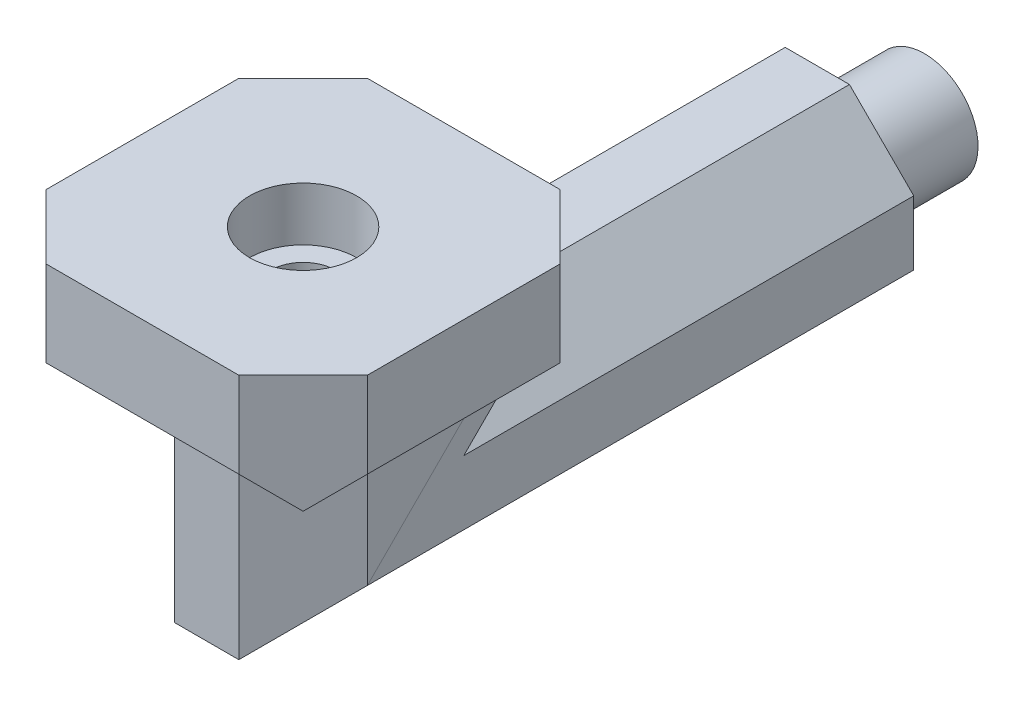
ISO-10303-21;
HEADER;
FILE_DESCRIPTION(('STEP AP214'),'2;1');
FILE_NAME('part.step','',(''),(''),'','','');
FILE_SCHEMA(('AUTOMOTIVE_DESIGN { 1 0 10303 214 1 1 1 1 }'));
ENDSEC;
DATA;
#1=APPLICATION_CONTEXT('core data for automotive mechanical design processes');
#2=APPLICATION_PROTOCOL_DEFINITION('international standard','automotive_design',2000,#1);
#3=PRODUCT_CONTEXT('',#1,'mechanical');
#4=PRODUCT('Part','Part','',(#3));
#5=PRODUCT_RELATED_PRODUCT_CATEGORY('part','',(#4));
#6=PRODUCT_DEFINITION_FORMATION('','',#4);
#7=PRODUCT_DEFINITION_CONTEXT('part definition',#1,'design');
#8=PRODUCT_DEFINITION('design','',#6,#7);
#9=PRODUCT_DEFINITION_SHAPE('','',#8);
#10=(LENGTH_UNIT() NAMED_UNIT(*) SI_UNIT(.MILLI.,.METRE.));
#11=(NAMED_UNIT(*) PLANE_ANGLE_UNIT() SI_UNIT($,.RADIAN.));
#12=(NAMED_UNIT(*) SI_UNIT($,.STERADIAN.) SOLID_ANGLE_UNIT());
#13=UNCERTAINTY_MEASURE_WITH_UNIT(LENGTH_MEASURE(1.E-05),#10,'distance_accuracy_value','');
#14=(GEOMETRIC_REPRESENTATION_CONTEXT(3) GLOBAL_UNCERTAINTY_ASSIGNED_CONTEXT((#13)) GLOBAL_UNIT_ASSIGNED_CONTEXT((#10,
#11,#12)) REPRESENTATION_CONTEXT('',''));
#15=CARTESIAN_POINT('',(0.,0.,0.));
#16=DIRECTION('',(0.,0.,1.));
#17=DIRECTION('',(1.,0.,0.));
#18=AXIS2_PLACEMENT_3D('',#15,#16,#17);
#19=CARTESIAN_POINT('',(-4.5,-11.5,5.05));
#20=DIRECTION('',(0.,-1.,0.));
#21=DIRECTION('',(0.,0.,-1.));
#22=AXIS2_PLACEMENT_3D('',#19,#20,#21);
#23=PLANE('',#22);
#24=CARTESIAN_POINT('',(0.,-11.5,0.));
#25=DIRECTION('',(0.,1.,0.));
#26=DIRECTION('',(0.,0.,1.));
#27=AXIS2_PLACEMENT_3D('',#24,#25,#26);
#28=CIRCLE('',#27,1.5);
#29=CARTESIAN_POINT('',(-1.49999999999999,-11.5,0.));
#30=VERTEX_POINT('',#29);
#31=CARTESIAN_POINT('',(1.49999999999999,-11.5,0.));
#32=VERTEX_POINT('',#31);
#33=EDGE_CURVE('E113',#30,#32,#28,.T.);
#34=ORIENTED_EDGE('',*,*,#33,.T.);
#35=DIRECTION('',(0.,0.,1.));
#36=VECTOR('',#35,1.);
#37=CARTESIAN_POINT('',(1.49999999999998,-11.5,5.05));
#38=LINE('',#37,#36);
#39=CARTESIAN_POINT('',(1.49999999999998,-11.5,4.5));
#40=VERTEX_POINT('',#39);
#41=EDGE_CURVE('E267',#32,#40,#38,.T.);
#42=ORIENTED_EDGE('',*,*,#41,.T.);
#43=DIRECTION('',(1.,0.,0.));
#44=VECTOR('',#43,1.);
#45=CARTESIAN_POINT('',(-4.5,-11.5,4.5));
#46=LINE('',#45,#44);
#47=CARTESIAN_POINT('',(-1.5,-11.5,4.5));
#48=VERTEX_POINT('',#47);
#49=EDGE_CURVE('E330',#48,#40,#46,.T.);
#50=ORIENTED_EDGE('',*,*,#49,.F.);
#51=DIRECTION('',(0.,0.,-1.));
#52=VECTOR('',#51,1.);
#53=CARTESIAN_POINT('',(-1.5,-11.5,5.05));
#54=LINE('',#53,#52);
#55=EDGE_CURVE('E270',#48,#30,#54,.T.);
#56=ORIENTED_EDGE('',*,*,#55,.T.);
#57=EDGE_LOOP('',(#34,#42,#50,#56));
#58=FACE_BOUND('',#57,.T.);
#59=ADVANCED_FACE('F98',(#58),#23,.T.);
#60=CARTESIAN_POINT('',(-4.5,-11.5,5.05));
#61=DIRECTION('',(-1.,0.,0.));
#62=DIRECTION('',(0.,-1.,0.));
#63=AXIS2_PLACEMENT_3D('',#60,#61,#62);
#64=PLANE('',#63);
#65=DIRECTION('',(0.,0.,-1.));
#66=VECTOR('',#65,1.);
#67=CARTESIAN_POINT('',(-4.5,-5.5,5.05));
#68=LINE('',#67,#66);
#69=CARTESIAN_POINT('',(-4.5,-5.5,-3.00000000000009));
#70=VERTEX_POINT('',#69);
#71=CARTESIAN_POINT('',(-4.5,-5.5,-24.));
#72=VERTEX_POINT('',#71);
#73=EDGE_CURVE('E279',#70,#72,#68,.T.);
#74=ORIENTED_EDGE('',*,*,#73,.T.);
#75=DIRECTION('',(0.,-1.,0.));
#76=VECTOR('',#75,1.);
#77=CARTESIAN_POINT('',(-4.5,-11.5,-24.));
#78=LINE('',#77,#76);
#79=CARTESIAN_POINT('',(-4.5,-8.49999999999999,-24.));
#80=VERTEX_POINT('',#79);
#81=EDGE_CURVE('E316',#72,#80,#78,.T.);
#82=ORIENTED_EDGE('',*,*,#81,.T.);
#83=DIRECTION('',(0.,0.,1.));
#84=VECTOR('',#83,1.);
#85=CARTESIAN_POINT('',(-4.5,-8.49999999999999,5.05));
#86=LINE('',#85,#84);
#87=CARTESIAN_POINT('',(-4.5,-8.49999999999999,1.49999999999999));
#88=VERTEX_POINT('',#87);
#89=EDGE_CURVE('E447',#80,#88,#86,.T.);
#90=ORIENTED_EDGE('',*,*,#89,.T.);
#91=DIRECTION('',(0.,-0.707106781186548,0.707106781186548));
#92=VECTOR('',#91,1.);
#93=CARTESIAN_POINT('',(-4.5,-5.75,-1.25));
#94=LINE('',#93,#92);
#95=CARTESIAN_POINT('',(-4.5,-4.00000000000007,-2.99999999999993));
#96=VERTEX_POINT('',#95);
#97=EDGE_CURVE('E332',#96,#88,#94,.T.);
#98=ORIENTED_EDGE('',*,*,#97,.F.);
#99=DIRECTION('',(0.,0.,-1.));
#100=VECTOR('',#99,1.);
#101=CARTESIAN_POINT('',(-4.5,-4.00000000000007,5.05));
#102=LINE('',#101,#100);
#103=CARTESIAN_POINT('',(-4.5,-4.00000000000007,-4.5));
#104=VERTEX_POINT('',#103);
#105=EDGE_CURVE('E383',#96,#104,#102,.T.);
#106=ORIENTED_EDGE('',*,*,#105,.T.);
#107=DIRECTION('',(0.,-0.707106781186551,0.707106781186544));
#108=VECTOR('',#107,1.);
#109=CARTESIAN_POINT('',(-4.5,-4.00000000000007,-4.5));
#110=LINE('',#109,#108);
#111=EDGE_CURVE('E448',#104,#70,#110,.T.);
#112=ORIENTED_EDGE('',*,*,#111,.T.);
#113=EDGE_LOOP('',(#74,#82,#90,#98,#106,#112));
#114=FACE_BOUND('',#113,.T.);
#115=ADVANCED_FACE('F451',(#114),#64,.T.);
#116=CARTESIAN_POINT('',(-4.5,-2.5,5.05));
#117=DIRECTION('',(0.,1.,0.));
#118=DIRECTION('',(0.,0.,1.));
#119=AXIS2_PLACEMENT_3D('',#116,#117,#118);
#120=PLANE('',#119);
#121=DIRECTION('',(0.,0.,-1.));
#122=VECTOR('',#121,1.);
#123=CARTESIAN_POINT('',(1.5,-2.5,5.05));
#124=LINE('',#123,#122);
#125=CARTESIAN_POINT('',(1.5,-2.5,-6.00000000000006));
#126=VERTEX_POINT('',#125);
#127=CARTESIAN_POINT('',(1.5,-2.5,-24.));
#128=VERTEX_POINT('',#127);
#129=EDGE_CURVE('E437',#126,#128,#124,.T.);
#130=ORIENTED_EDGE('',*,*,#129,.T.);
#131=DIRECTION('',(-1.,0.,0.));
#132=VECTOR('',#131,1.);
#133=CARTESIAN_POINT('',(-4.5,-2.5,-24.));
#134=LINE('',#133,#132);
#135=CARTESIAN_POINT('',(-1.49999999999998,-2.5,-24.));
#136=VERTEX_POINT('',#135);
#137=EDGE_CURVE('E323',#128,#136,#134,.T.);
#138=ORIENTED_EDGE('',*,*,#137,.T.);
#139=DIRECTION('',(0.,0.,1.));
#140=VECTOR('',#139,1.);
#141=CARTESIAN_POINT('',(-1.49999999999998,-2.5,5.05));
#142=LINE('',#141,#140);
#143=CARTESIAN_POINT('',(-1.49999999999998,-2.5,-6.00000000000006));
#144=VERTEX_POINT('',#143);
#145=EDGE_CURVE('E426',#136,#144,#142,.T.);
#146=ORIENTED_EDGE('',*,*,#145,.T.);
#147=DIRECTION('',(1.,0.,0.));
#148=VECTOR('',#147,1.);
#149=CARTESIAN_POINT('',(-4.5,-2.5,-6.00000000000006));
#150=LINE('',#149,#148);
#151=EDGE_CURVE('E377',#144,#126,#150,.T.);
#152=ORIENTED_EDGE('',*,*,#151,.T.);
#153=EDGE_LOOP('',(#130,#138,#146,#152));
#154=FACE_BOUND('',#153,.T.);
#155=ADVANCED_FACE('F463',(#154),#120,.T.);
#156=CARTESIAN_POINT('',(4.5,-11.5,5.05));
#157=DIRECTION('',(1.,0.,0.));
#158=DIRECTION('',(0.,1.,0.));
#159=AXIS2_PLACEMENT_3D('',#156,#157,#158);
#160=PLANE('',#159);
#161=DIRECTION('',(0.,0.,-1.));
#162=VECTOR('',#161,1.);
#163=CARTESIAN_POINT('',(4.5,-8.49999999999999,5.05));
#164=LINE('',#163,#162);
#165=CARTESIAN_POINT('',(4.5,-8.49999999999999,1.49999999999999));
#166=VERTEX_POINT('',#165);
#167=CARTESIAN_POINT('',(4.5,-8.49999999999999,-24.));
#168=VERTEX_POINT('',#167);
#169=EDGE_CURVE('E440',#166,#168,#164,.T.);
#170=ORIENTED_EDGE('',*,*,#169,.T.);
#171=DIRECTION('',(0.,1.,0.));
#172=VECTOR('',#171,1.);
#173=CARTESIAN_POINT('',(4.5,-11.5,-24.));
#174=LINE('',#173,#172);
#175=CARTESIAN_POINT('',(4.5,-5.50000000000001,-24.));
#176=VERTEX_POINT('',#175);
#177=EDGE_CURVE('E121',#168,#176,#174,.T.);
#178=ORIENTED_EDGE('',*,*,#177,.T.);
#179=DIRECTION('',(0.,0.,1.));
#180=VECTOR('',#179,1.);
#181=CARTESIAN_POINT('',(4.5,-5.50000000000001,5.05));
#182=LINE('',#181,#180);
#183=CARTESIAN_POINT('',(4.5,-5.50000000000001,-3.00000000000008));
#184=VERTEX_POINT('',#183);
#185=EDGE_CURVE('E445',#176,#184,#182,.T.);
#186=ORIENTED_EDGE('',*,*,#185,.T.);
#187=DIRECTION('',(0.,0.707106781186551,-0.707106781186544));
#188=VECTOR('',#187,1.);
#189=CARTESIAN_POINT('',(4.5,-4.00000000000007,-4.5));
#190=LINE('',#189,#188);
#191=CARTESIAN_POINT('',(4.5,-4.00000000000007,-4.5));
#192=VERTEX_POINT('',#191);
#193=EDGE_CURVE('E443',#184,#192,#190,.T.);
#194=ORIENTED_EDGE('',*,*,#193,.T.);
#195=DIRECTION('',(0.,0.,1.));
#196=VECTOR('',#195,1.);
#197=CARTESIAN_POINT('',(4.5,-4.00000000000007,5.05));
#198=LINE('',#197,#196);
#199=CARTESIAN_POINT('',(4.5,-4.00000000000007,-2.99999999999993));
#200=VERTEX_POINT('',#199);
#201=EDGE_CURVE('E380',#192,#200,#198,.T.);
#202=ORIENTED_EDGE('',*,*,#201,.T.);
#203=DIRECTION('',(0.,0.707106781186548,-0.707106781186548));
#204=VECTOR('',#203,1.);
#205=CARTESIAN_POINT('',(4.5,-5.75,-1.25));
#206=LINE('',#205,#204);
#207=EDGE_CURVE('E327',#166,#200,#206,.T.);
#208=ORIENTED_EDGE('',*,*,#207,.F.);
#209=EDGE_LOOP('',(#170,#178,#186,#194,#202,#208));
#210=FACE_BOUND('',#209,.T.);
#211=ADVANCED_FACE('F554',(#210),#160,.T.);
#212=EDGE_CURVE('E256',#32,#30,#28,.T.);
#213=ORIENTED_EDGE('',*,*,#212,.T.);
#214=CARTESIAN_POINT('',(-1.5,-11.5,-24.));
#215=VERTEX_POINT('',#214);
#216=EDGE_CURVE('E285',#30,#215,#54,.T.);
#217=ORIENTED_EDGE('',*,*,#216,.T.);
#218=DIRECTION('',(1.,0.,0.));
#219=VECTOR('',#218,1.);
#220=CARTESIAN_POINT('',(-4.5,-11.5,-24.));
#221=LINE('',#220,#219);
#222=CARTESIAN_POINT('',(1.49999999999998,-11.5,-24.));
#223=VERTEX_POINT('',#222);
#224=EDGE_CURVE('E284',#215,#223,#221,.T.);
#225=ORIENTED_EDGE('',*,*,#224,.T.);
#226=EDGE_CURVE('E275',#223,#32,#38,.T.);
#227=ORIENTED_EDGE('',*,*,#226,.T.);
#228=EDGE_LOOP('',(#213,#217,#225,#227));
#229=FACE_BOUND('',#228,.T.);
#230=ADVANCED_FACE('F282',(#229),#23,.T.);
#231=CARTESIAN_POINT('',(1.5,-2.5,5.05));
#232=DIRECTION('',(-0.707106781186549,-0.707106781186546,0.));
#233=DIRECTION('',(0.,0.,-1.));
#234=AXIS2_PLACEMENT_3D('',#231,#232,#233);
#235=PLANE('',#234);
#236=ORIENTED_EDGE('',*,*,#185,.F.);
#237=DIRECTION('',(0.707106781186546,-0.707106781186549,0.));
#238=VECTOR('',#237,1.);
#239=CARTESIAN_POINT('',(1.5,-2.5,-24.));
#240=LINE('',#239,#238);
#241=EDGE_CURVE('E469',#176,#128,#240,.F.);
#242=ORIENTED_EDGE('',*,*,#241,.T.);
#243=ORIENTED_EDGE('',*,*,#129,.F.);
#244=DIRECTION('',(0.577350269189627,-0.577350269189629,0.577350269189622));
#245=VECTOR('',#244,1.);
#246=CARTESIAN_POINT('',(0.500000000000039,-1.50000000000003,-7.00000000000001));
#247=LINE('',#246,#245);
#248=EDGE_CURVE('E298',#184,#126,#247,.F.);
#249=ORIENTED_EDGE('',*,*,#248,.F.);
#250=EDGE_LOOP('',(#236,#242,#243,#249));
#251=FACE_BOUND('',#250,.T.);
#252=ADVANCED_FACE('F468',(#251),#235,.F.);
#253=CARTESIAN_POINT('',(-4.5,-5.5,5.05));
#254=DIRECTION('',(0.707106781186546,-0.707106781186549,0.));
#255=DIRECTION('',(0.,0.,-1.));
#256=AXIS2_PLACEMENT_3D('',#253,#254,#255);
#257=PLANE('',#256);
#258=ORIENTED_EDGE('',*,*,#145,.F.);
#259=DIRECTION('',(0.707106781186549,0.707106781186546,0.));
#260=VECTOR('',#259,1.);
#261=CARTESIAN_POINT('',(-4.5,-5.5,-24.));
#262=LINE('',#261,#260);
#263=EDGE_CURVE('E314',#136,#72,#262,.F.);
#264=ORIENTED_EDGE('',*,*,#263,.T.);
#265=ORIENTED_EDGE('',*,*,#73,.F.);
#266=DIRECTION('',(0.57735026918963,0.577350269189627,-0.577350269189621));
#267=VECTOR('',#266,1.);
#268=CARTESIAN_POINT('',(-3.50000000000005,-4.50000000000005,-4.00000000000002));
#269=LINE('',#268,#267);
#270=EDGE_CURVE('E300',#144,#70,#269,.F.);
#271=ORIENTED_EDGE('',*,*,#270,.F.);
#272=EDGE_LOOP('',(#258,#264,#265,#271));
#273=FACE_BOUND('',#272,.T.);
#274=ADVANCED_FACE('F454',(#273),#257,.F.);
#275=CARTESIAN_POINT('',(-1.5,-11.5,5.05));
#276=DIRECTION('',(0.707106781186549,0.707106781186546,0.));
#277=DIRECTION('',(0.,0.,-1.));
#278=AXIS2_PLACEMENT_3D('',#275,#276,#277);
#279=PLANE('',#278);
#280=ORIENTED_EDGE('',*,*,#89,.F.);
#281=DIRECTION('',(-0.707106781186546,0.707106781186549,0.));
#282=VECTOR('',#281,1.);
#283=CARTESIAN_POINT('',(-1.5,-11.5,-24.));
#284=LINE('',#283,#282);
#285=EDGE_CURVE('E470',#80,#215,#284,.F.);
#286=ORIENTED_EDGE('',*,*,#285,.T.);
#287=ORIENTED_EDGE('',*,*,#216,.F.);
#288=ORIENTED_EDGE('',*,*,#55,.F.);
#289=DIRECTION('',(0.577350269189625,-0.577350269189627,0.577350269189626));
#290=VECTOR('',#289,1.);
#291=CARTESIAN_POINT('',(-5.33333333333333,-7.66666666666666,0.666666666666656));
#292=LINE('',#291,#290);
#293=EDGE_CURVE('E311',#48,#88,#292,.F.);
#294=ORIENTED_EDGE('',*,*,#293,.T.);
#295=EDGE_LOOP('',(#280,#286,#287,#288,#294));
#296=FACE_BOUND('',#295,.T.);
#297=ADVANCED_FACE('F559',(#296),#279,.F.);
#298=CARTESIAN_POINT('',(4.5,-8.49999999999999,5.05));
#299=DIRECTION('',(-0.707106781186546,0.707106781186549,0.));
#300=DIRECTION('',(0.,0.,-1.));
#301=AXIS2_PLACEMENT_3D('',#298,#299,#300);
#302=PLANE('',#301);
#303=ORIENTED_EDGE('',*,*,#226,.F.);
#304=DIRECTION('',(-0.707106781186549,-0.707106781186546,0.));
#305=VECTOR('',#304,1.);
#306=CARTESIAN_POINT('',(4.5,-8.49999999999999,-24.));
#307=LINE('',#306,#305);
#308=EDGE_CURVE('E13',#223,#168,#307,.F.);
#309=ORIENTED_EDGE('',*,*,#308,.T.);
#310=ORIENTED_EDGE('',*,*,#169,.F.);
#311=DIRECTION('',(0.577350269189627,0.577350269189625,-0.577350269189625));
#312=VECTOR('',#311,1.);
#313=CARTESIAN_POINT('',(7.33333333333333,-5.66666666666667,-1.33333333333333));
#314=LINE('',#313,#312);
#315=EDGE_CURVE('E278',#166,#40,#314,.F.);
#316=ORIENTED_EDGE('',*,*,#315,.T.);
#317=ORIENTED_EDGE('',*,*,#41,.F.);
#318=EDGE_LOOP('',(#303,#309,#310,#316,#317));
#319=FACE_BOUND('',#318,.T.);
#320=ADVANCED_FACE('F274',(#319),#302,.F.);
#321=CARTESIAN_POINT('',(0.,3.,0.));
#322=DIRECTION('',(0.,-1.,0.));
#323=DIRECTION('',(0.,0.,-1.));
#324=AXIS2_PLACEMENT_3D('',#321,#322,#323);
#325=CYLINDRICAL_SURFACE('',#324,2.5);
#326=CARTESIAN_POINT('',(0.,0.5,0.));
#327=DIRECTION('',(0.,1.,0.));
#328=DIRECTION('',(0.,0.,1.));
#329=AXIS2_PLACEMENT_3D('',#326,#327,#328);
#330=CIRCLE('',#329,2.5);
#331=CARTESIAN_POINT('',(0.,0.5,2.5));
#332=VERTEX_POINT('',#331);
#333=EDGE_CURVE('E374',#332,#332,#330,.T.);
#334=ORIENTED_EDGE('',*,*,#333,.F.);
#335=EDGE_LOOP('',(#334));
#336=FACE_BOUND('',#335,.T.);
#337=CARTESIAN_POINT('',(0.,3.,0.));
#338=DIRECTION('',(0.,1.,0.));
#339=DIRECTION('',(0.,0.,1.));
#340=AXIS2_PLACEMENT_3D('',#337,#338,#339);
#341=CIRCLE('',#340,2.5);
#342=CARTESIAN_POINT('',(0.,3.,2.5));
#343=VERTEX_POINT('',#342);
#344=EDGE_CURVE('E329',#343,#343,#341,.T.);
#345=ORIENTED_EDGE('',*,*,#344,.T.);
#346=EDGE_LOOP('',(#345));
#347=FACE_BOUND('',#346,.T.);
#348=ADVANCED_FACE('F496',(#336,#347),#325,.F.);
#349=CARTESIAN_POINT('',(-7.5,3.,0.));
#350=DIRECTION('',(1.,0.,0.));
#351=DIRECTION('',(0.,0.,-1.));
#352=AXIS2_PLACEMENT_3D('',#349,#350,#351);
#353=PLANE('',#352);
#354=DIRECTION('',(0.,-1.,0.));
#355=VECTOR('',#354,1.);
#356=CARTESIAN_POINT('',(-7.5,0.,-4.5));
#357=LINE('',#356,#355);
#358=CARTESIAN_POINT('',(-7.5,3.,-4.5));
#359=VERTEX_POINT('',#358);
#360=CARTESIAN_POINT('',(-7.5,-1.00000000000004,-4.5));
#361=VERTEX_POINT('',#360);
#362=EDGE_CURVE('E370',#359,#361,#357,.T.);
#363=ORIENTED_EDGE('',*,*,#362,.T.);
#364=DIRECTION('',(0.,0.,1.));
#365=VECTOR('',#364,1.);
#366=CARTESIAN_POINT('',(-7.5,-1.00000000000004,0.));
#367=LINE('',#366,#365);
#368=CARTESIAN_POINT('',(-7.5,-1.00000000000004,4.49999999999999));
#369=VERTEX_POINT('',#368);
#370=EDGE_CURVE('E421',#361,#369,#367,.T.);
#371=ORIENTED_EDGE('',*,*,#370,.T.);
#372=DIRECTION('',(0.,1.,0.));
#373=VECTOR('',#372,1.);
#374=CARTESIAN_POINT('',(-7.5,3.,4.49999999999999));
#375=LINE('',#374,#373);
#376=CARTESIAN_POINT('',(-7.5,3.,4.49999999999999));
#377=VERTEX_POINT('',#376);
#378=EDGE_CURVE('E372',#369,#377,#375,.T.);
#379=ORIENTED_EDGE('',*,*,#378,.T.);
#380=DIRECTION('',(0.,0.,1.));
#381=VECTOR('',#380,1.);
#382=CARTESIAN_POINT('',(-7.5,3.,0.));
#383=LINE('',#382,#381);
#384=EDGE_CURVE('E344',#359,#377,#383,.T.);
#385=ORIENTED_EDGE('',*,*,#384,.F.);
#386=EDGE_LOOP('',(#363,#371,#379,#385));
#387=FACE_BOUND('',#386,.T.);
#388=ADVANCED_FACE('F499',(#387),#353,.F.);
#389=CARTESIAN_POINT('',(0.,3.,-7.5));
#390=DIRECTION('',(0.,0.,-1.));
#391=DIRECTION('',(-1.,0.,0.));
#392=AXIS2_PLACEMENT_3D('',#389,#390,#391);
#393=PLANE('',#392);
#394=DIRECTION('',(1.,0.,0.));
#395=VECTOR('',#394,1.);
#396=CARTESIAN_POINT('',(0.,3.,-7.5));
#397=LINE('',#396,#395);
#398=CARTESIAN_POINT('',(-4.49999999999999,3.,-7.5));
#399=VERTEX_POINT('',#398);
#400=CARTESIAN_POINT('',(4.5,3.,-7.5));
#401=VERTEX_POINT('',#400);
#402=EDGE_CURVE('E341',#399,#401,#397,.T.);
#403=ORIENTED_EDGE('',*,*,#402,.T.);
#404=DIRECTION('',(0.,-1.,0.));
#405=VECTOR('',#404,1.);
#406=CARTESIAN_POINT('',(4.5,3.,-7.5));
#407=LINE('',#406,#405);
#408=CARTESIAN_POINT('',(4.5,-1.00000000000004,-7.5));
#409=VERTEX_POINT('',#408);
#410=EDGE_CURVE('E352',#401,#409,#407,.T.);
#411=ORIENTED_EDGE('',*,*,#410,.T.);
#412=DIRECTION('',(-1.,0.,0.));
#413=VECTOR('',#412,1.);
#414=CARTESIAN_POINT('',(-4.5,-1.00000000000004,-7.5));
#415=LINE('',#414,#413);
#416=CARTESIAN_POINT('',(-4.49999999999999,-1.00000000000004,-7.5));
#417=VERTEX_POINT('',#416);
#418=EDGE_CURVE('E397',#409,#417,#415,.T.);
#419=ORIENTED_EDGE('',*,*,#418,.T.);
#420=DIRECTION('',(0.,1.,0.));
#421=VECTOR('',#420,1.);
#422=CARTESIAN_POINT('',(-4.49999999999999,3.,-7.5));
#423=LINE('',#422,#421);
#424=EDGE_CURVE('E350',#417,#399,#423,.T.);
#425=ORIENTED_EDGE('',*,*,#424,.T.);
#426=EDGE_LOOP('',(#403,#411,#419,#425));
#427=FACE_BOUND('',#426,.T.);
#428=ADVANCED_FACE('F520',(#427),#393,.T.);
#429=CARTESIAN_POINT('',(7.5,3.,0.));
#430=DIRECTION('',(1.,0.,0.));
#431=DIRECTION('',(0.,0.,-1.));
#432=AXIS2_PLACEMENT_3D('',#429,#430,#431);
#433=PLANE('',#432);
#434=DIRECTION('',(0.,-1.,0.));
#435=VECTOR('',#434,1.);
#436=CARTESIAN_POINT('',(7.5,0.,4.5));
#437=LINE('',#436,#435);
#438=CARTESIAN_POINT('',(7.5,3.,4.5));
#439=VERTEX_POINT('',#438);
#440=CARTESIAN_POINT('',(7.5,-1.00000000000004,4.5));
#441=VERTEX_POINT('',#440);
#442=EDGE_CURVE('E354',#439,#441,#437,.T.);
#443=ORIENTED_EDGE('',*,*,#442,.T.);
#444=DIRECTION('',(0.,0.,-1.));
#445=VECTOR('',#444,1.);
#446=CARTESIAN_POINT('',(7.5,-1.00000000000004,4.5));
#447=LINE('',#446,#445);
#448=CARTESIAN_POINT('',(7.5,-1.00000000000004,-4.49999999999999));
#449=VERTEX_POINT('',#448);
#450=EDGE_CURVE('E405',#441,#449,#447,.T.);
#451=ORIENTED_EDGE('',*,*,#450,.T.);
#452=DIRECTION('',(0.,1.,0.));
#453=VECTOR('',#452,1.);
#454=CARTESIAN_POINT('',(7.5,3.,-4.49999999999999));
#455=LINE('',#454,#453);
#456=CARTESIAN_POINT('',(7.5,3.,-4.49999999999999));
#457=VERTEX_POINT('',#456);
#458=EDGE_CURVE('E356',#449,#457,#455,.T.);
#459=ORIENTED_EDGE('',*,*,#458,.T.);
#460=DIRECTION('',(0.,0.,1.));
#461=VECTOR('',#460,1.);
#462=CARTESIAN_POINT('',(7.5,3.,0.));
#463=LINE('',#462,#461);
#464=EDGE_CURVE('E338',#457,#439,#463,.T.);
#465=ORIENTED_EDGE('',*,*,#464,.T.);
#466=EDGE_LOOP('',(#443,#451,#459,#465));
#467=FACE_BOUND('',#466,.T.);
#468=ADVANCED_FACE('F546',(#467),#433,.T.);
#469=CARTESIAN_POINT('',(0.,3.,7.5));
#470=DIRECTION('',(0.,0.,-1.));
#471=DIRECTION('',(-1.,0.,0.));
#472=AXIS2_PLACEMENT_3D('',#469,#470,#471);
#473=PLANE('',#472);
#474=DIRECTION('',(0.,-1.,0.));
#475=VECTOR('',#474,1.);
#476=CARTESIAN_POINT('',(-4.5,3.,7.5));
#477=LINE('',#476,#475);
#478=CARTESIAN_POINT('',(-4.5,3.,7.5));
#479=VERTEX_POINT('',#478);
#480=CARTESIAN_POINT('',(-4.5,-1.00000000000004,7.5));
#481=VERTEX_POINT('',#480);
#482=EDGE_CURVE('E366',#479,#481,#477,.T.);
#483=ORIENTED_EDGE('',*,*,#482,.T.);
#484=DIRECTION('',(1.,0.,0.));
#485=VECTOR('',#484,1.);
#486=CARTESIAN_POINT('',(0.,-1.00000000000004,7.5));
#487=LINE('',#486,#485);
#488=CARTESIAN_POINT('',(4.49999999999999,-1.00000000000004,7.5));
#489=VERTEX_POINT('',#488);
#490=EDGE_CURVE('E413',#481,#489,#487,.T.);
#491=ORIENTED_EDGE('',*,*,#490,.T.);
#492=DIRECTION('',(0.,1.,0.));
#493=VECTOR('',#492,1.);
#494=CARTESIAN_POINT('',(4.49999999999999,3.,7.5));
#495=LINE('',#494,#493);
#496=CARTESIAN_POINT('',(4.49999999999999,3.,7.5));
#497=VERTEX_POINT('',#496);
#498=EDGE_CURVE('E368',#489,#497,#495,.T.);
#499=ORIENTED_EDGE('',*,*,#498,.T.);
#500=DIRECTION('',(1.,0.,0.));
#501=VECTOR('',#500,1.);
#502=CARTESIAN_POINT('',(0.,3.,7.5));
#503=LINE('',#502,#501);
#504=EDGE_CURVE('E347',#479,#497,#503,.T.);
#505=ORIENTED_EDGE('',*,*,#504,.F.);
#506=EDGE_LOOP('',(#483,#491,#499,#505));
#507=FACE_BOUND('',#506,.T.);
#508=ADVANCED_FACE('F507',(#507),#473,.F.);
#509=CARTESIAN_POINT('',(0.,3.,0.));
#510=DIRECTION('',(0.,1.,0.));
#511=DIRECTION('',(0.,0.,1.));
#512=AXIS2_PLACEMENT_3D('',#509,#510,#511);
#513=PLANE('',#512);
#514=ORIENTED_EDGE('',*,*,#344,.F.);
#515=EDGE_LOOP('',(#514));
#516=FACE_BOUND('',#515,.T.);
#517=ORIENTED_EDGE('',*,*,#464,.F.);
#518=DIRECTION('',(0.707106781186546,0.,0.707106781186549));
#519=VECTOR('',#518,1.);
#520=CARTESIAN_POINT('',(6.00000000000001,3.,-5.99999999999999));
#521=LINE('',#520,#519);
#522=EDGE_CURVE('E364',#457,#401,#521,.F.);
#523=ORIENTED_EDGE('',*,*,#522,.T.);
#524=ORIENTED_EDGE('',*,*,#402,.F.);
#525=DIRECTION('',(-0.707106781186549,0.,0.707106781186546));
#526=VECTOR('',#525,1.);
#527=CARTESIAN_POINT('',(-5.99999999999999,3.,-6.00000000000001));
#528=LINE('',#527,#526);
#529=EDGE_CURVE('E358',#399,#359,#528,.T.);
#530=ORIENTED_EDGE('',*,*,#529,.T.);
#531=ORIENTED_EDGE('',*,*,#384,.T.);
#532=DIRECTION('',(-0.707106781186546,0.,-0.707106781186549));
#533=VECTOR('',#532,1.);
#534=CARTESIAN_POINT('',(-6.00000000000001,3.,5.99999999999999));
#535=LINE('',#534,#533);
#536=EDGE_CURVE('E360',#377,#479,#535,.F.);
#537=ORIENTED_EDGE('',*,*,#536,.T.);
#538=ORIENTED_EDGE('',*,*,#504,.T.);
#539=DIRECTION('',(0.707106781186549,0.,-0.707106781186546));
#540=VECTOR('',#539,1.);
#541=CARTESIAN_POINT('',(5.99999999999999,3.,6.00000000000001));
#542=LINE('',#541,#540);
#543=EDGE_CURVE('E362',#497,#439,#542,.T.);
#544=ORIENTED_EDGE('',*,*,#543,.T.);
#545=EDGE_LOOP('',(#517,#523,#524,#530,#531,#537,#538,#544));
#546=FACE_BOUND('',#545,.T.);
#547=ADVANCED_FACE('F503',(#516,#546),#513,.T.);
#548=CARTESIAN_POINT('',(4.5,3.,-7.5));
#549=DIRECTION('',(-0.707106781186549,0.,0.707106781186546));
#550=DIRECTION('',(0.,-1.,0.));
#551=AXIS2_PLACEMENT_3D('',#548,#549,#550);
#552=PLANE('',#551);
#553=ORIENTED_EDGE('',*,*,#522,.F.);
#554=ORIENTED_EDGE('',*,*,#458,.F.);
#555=DIRECTION('',(0.577350269189623,0.577350269189629,0.577350269189625));
#556=VECTOR('',#555,1.);
#557=CARTESIAN_POINT('',(8.49999999999998,0.,-3.50000000000001));
#558=LINE('',#557,#556);
#559=CARTESIAN_POINT('',(6.,-2.50000000000006,-6.));
#560=VERTEX_POINT('',#559);
#561=EDGE_CURVE('E408',#449,#560,#558,.F.);
#562=ORIENTED_EDGE('',*,*,#561,.T.);
#563=DIRECTION('',(0.577350269189622,-0.577350269189631,0.577350269189624));
#564=VECTOR('',#563,1.);
#565=CARTESIAN_POINT('',(3.50000000000004,0.,-8.49999999999996));
#566=LINE('',#565,#564);
#567=EDGE_CURVE('E394',#560,#409,#566,.F.);
#568=ORIENTED_EDGE('',*,*,#567,.T.);
#569=ORIENTED_EDGE('',*,*,#410,.F.);
#570=EDGE_LOOP('',(#553,#554,#562,#568,#569));
#571=FACE_BOUND('',#570,.T.);
#572=ADVANCED_FACE('F506',(#571),#552,.F.);
#573=CARTESIAN_POINT('',(7.5,3.,4.5));
#574=DIRECTION('',(0.707106781186546,0.,0.707106781186549));
#575=DIRECTION('',(0.,1.,0.));
#576=AXIS2_PLACEMENT_3D('',#573,#574,#575);
#577=PLANE('',#576);
#578=ORIENTED_EDGE('',*,*,#543,.F.);
#579=ORIENTED_EDGE('',*,*,#498,.F.);
#580=DIRECTION('',(0.577350269189625,-0.577350269189629,-0.577350269189623));
#581=VECTOR('',#580,1.);
#582=CARTESIAN_POINT('',(3.50000000000001,0.,8.49999999999998));
#583=LINE('',#582,#581);
#584=CARTESIAN_POINT('',(6.,-2.50000000000005,6.));
#585=VERTEX_POINT('',#584);
#586=EDGE_CURVE('E416',#489,#585,#583,.T.);
#587=ORIENTED_EDGE('',*,*,#586,.T.);
#588=DIRECTION('',(0.577350269189625,0.57735026918963,-0.577350269189623));
#589=VECTOR('',#588,1.);
#590=CARTESIAN_POINT('',(5.49999999999999,-3.00000000000007,6.50000000000001));
#591=LINE('',#590,#589);
#592=EDGE_CURVE('E402',#585,#441,#591,.T.);
#593=ORIENTED_EDGE('',*,*,#592,.T.);
#594=ORIENTED_EDGE('',*,*,#442,.F.);
#595=EDGE_LOOP('',(#578,#579,#587,#593,#594));
#596=FACE_BOUND('',#595,.T.);
#597=ADVANCED_FACE('F543',(#596),#577,.T.);
#598=CARTESIAN_POINT('',(-4.5,3.,7.5));
#599=DIRECTION('',(0.707106781186549,0.,-0.707106781186546));
#600=DIRECTION('',(0.,-1.,0.));
#601=AXIS2_PLACEMENT_3D('',#598,#599,#600);
#602=PLANE('',#601);
#603=ORIENTED_EDGE('',*,*,#536,.F.);
#604=ORIENTED_EDGE('',*,*,#378,.F.);
#605=DIRECTION('',(-0.577350269189623,0.577350269189629,-0.577350269189625));
#606=VECTOR('',#605,1.);
#607=CARTESIAN_POINT('',(-5.49999999999999,-3.00000000000007,6.5));
#608=LINE('',#607,#606);
#609=CARTESIAN_POINT('',(-6.,-2.50000000000006,5.99999999999999));
#610=VERTEX_POINT('',#609);
#611=EDGE_CURVE('E424',#369,#610,#608,.F.);
#612=ORIENTED_EDGE('',*,*,#611,.T.);
#613=DIRECTION('',(-0.577350269189622,-0.57735026918963,-0.577350269189625));
#614=VECTOR('',#613,1.);
#615=CARTESIAN_POINT('',(-6.5,-3.00000000000007,5.49999999999999));
#616=LINE('',#615,#614);
#617=EDGE_CURVE('E410',#610,#481,#616,.F.);
#618=ORIENTED_EDGE('',*,*,#617,.T.);
#619=ORIENTED_EDGE('',*,*,#482,.F.);
#620=EDGE_LOOP('',(#603,#604,#612,#618,#619));
#621=FACE_BOUND('',#620,.T.);
#622=ADVANCED_FACE('F537',(#621),#602,.F.);
#623=CARTESIAN_POINT('',(-7.5,3.,-4.5));
#624=DIRECTION('',(-0.707106781186546,0.,-0.707106781186549));
#625=DIRECTION('',(0.,1.,0.));
#626=AXIS2_PLACEMENT_3D('',#623,#624,#625);
#627=PLANE('',#626);
#628=ORIENTED_EDGE('',*,*,#529,.F.);
#629=ORIENTED_EDGE('',*,*,#424,.F.);
#630=DIRECTION('',(-0.577350269189625,-0.577350269189629,0.577350269189623));
#631=VECTOR('',#630,1.);
#632=CARTESIAN_POINT('',(-6.5,-3.00000000000007,-5.49999999999999));
#633=LINE('',#632,#631);
#634=CARTESIAN_POINT('',(-6.,-2.50000000000006,-6.));
#635=VERTEX_POINT('',#634);
#636=EDGE_CURVE('E400',#417,#635,#633,.T.);
#637=ORIENTED_EDGE('',*,*,#636,.T.);
#638=DIRECTION('',(-0.577350269189625,0.57735026918963,0.577350269189623));
#639=VECTOR('',#638,1.);
#640=CARTESIAN_POINT('',(-8.49999999999997,0.,-3.50000000000004));
#641=LINE('',#640,#639);
#642=EDGE_CURVE('E418',#635,#361,#641,.T.);
#643=ORIENTED_EDGE('',*,*,#642,.T.);
#644=ORIENTED_EDGE('',*,*,#362,.F.);
#645=EDGE_LOOP('',(#628,#629,#637,#643,#644));
#646=FACE_BOUND('',#645,.T.);
#647=ADVANCED_FACE('F491',(#646),#627,.T.);
#648=CARTESIAN_POINT('',(0.,0.5,0.));
#649=DIRECTION('',(0.,1.,0.));
#650=DIRECTION('',(0.,0.,1.));
#651=AXIS2_PLACEMENT_3D('',#648,#649,#650);
#652=PLANE('',#651);
#653=CARTESIAN_POINT('',(0.,0.5,0.));
#654=DIRECTION('',(0.,1.,0.));
#655=DIRECTION('',(0.,0.,1.));
#656=AXIS2_PLACEMENT_3D('',#653,#654,#655);
#657=CIRCLE('',#656,1.49999999999999);
#658=CARTESIAN_POINT('',(0.,0.5,1.49999999999999));
#659=VERTEX_POINT('',#658);
#660=EDGE_CURVE('E261',#659,#659,#657,.T.);
#661=ORIENTED_EDGE('',*,*,#660,.F.);
#662=EDGE_LOOP('',(#661));
#663=FACE_BOUND('',#662,.T.);
#664=ORIENTED_EDGE('',*,*,#333,.T.);
#665=EDGE_LOOP('',(#664));
#666=FACE_BOUND('',#665,.T.);
#667=ADVANCED_FACE('F487',(#663,#666),#652,.T.);
#668=CARTESIAN_POINT('',(-4.5,0.,4.5));
#669=DIRECTION('',(0.,0.,1.));
#670=DIRECTION('',(0.,-1.,0.));
#671=AXIS2_PLACEMENT_3D('',#668,#669,#670);
#672=PLANE('',#671);
#673=DIRECTION('',(-1.,0.,0.));
#674=VECTOR('',#673,1.);
#675=CARTESIAN_POINT('',(-4.5,-4.00000000000007,4.5));
#676=LINE('',#675,#674);
#677=CARTESIAN_POINT('',(1.49999999999998,-4.00000000000007,4.5));
#678=VERTEX_POINT('',#677);
#679=CARTESIAN_POINT('',(-1.5,-4.00000000000007,4.5));
#680=VERTEX_POINT('',#679);
#681=EDGE_CURVE('E389',#678,#680,#676,.T.);
#682=ORIENTED_EDGE('',*,*,#681,.T.);
#683=DIRECTION('',(0.,-1.,0.));
#684=VECTOR('',#683,1.);
#685=CARTESIAN_POINT('',(-1.5,0.,4.5));
#686=LINE('',#685,#684);
#687=EDGE_CURVE('E292',#680,#48,#686,.T.);
#688=ORIENTED_EDGE('',*,*,#687,.T.);
#689=ORIENTED_EDGE('',*,*,#49,.T.);
#690=DIRECTION('',(0.,1.,0.));
#691=VECTOR('',#690,1.);
#692=CARTESIAN_POINT('',(1.49999999999998,0.,4.5));
#693=LINE('',#692,#691);
#694=EDGE_CURVE('E290',#40,#678,#693,.T.);
#695=ORIENTED_EDGE('',*,*,#694,.T.);
#696=EDGE_LOOP('',(#682,#688,#689,#695));
#697=FACE_BOUND('',#696,.T.);
#698=ADVANCED_FACE('F490',(#697),#672,.T.);
#699=CARTESIAN_POINT('',(4.5,0.,4.5));
#700=DIRECTION('',(1.,0.,0.));
#701=DIRECTION('',(0.,0.,-1.));
#702=AXIS2_PLACEMENT_3D('',#699,#700,#701);
#703=PLANE('',#702);
#704=DIRECTION('',(0.,0.,1.));
#705=VECTOR('',#704,1.);
#706=CARTESIAN_POINT('',(4.5,-4.00000000000007,4.5));
#707=LINE('',#706,#705);
#708=CARTESIAN_POINT('',(4.5,-4.00000000000007,1.49999999999999));
#709=VERTEX_POINT('',#708);
#710=EDGE_CURVE('E386',#200,#709,#707,.T.);
#711=ORIENTED_EDGE('',*,*,#710,.T.);
#712=DIRECTION('',(0.,-1.,0.));
#713=VECTOR('',#712,1.);
#714=CARTESIAN_POINT('',(4.5,0.,1.49999999999999));
#715=LINE('',#714,#713);
#716=EDGE_CURVE('E296',#709,#166,#715,.T.);
#717=ORIENTED_EDGE('',*,*,#716,.T.);
#718=ORIENTED_EDGE('',*,*,#207,.T.);
#719=EDGE_LOOP('',(#711,#717,#718));
#720=FACE_BOUND('',#719,.T.);
#721=ADVANCED_FACE('F579',(#720),#703,.T.);
#722=CARTESIAN_POINT('',(-4.5,0.,4.5));
#723=DIRECTION('',(-1.,0.,0.));
#724=DIRECTION('',(0.,0.,1.));
#725=AXIS2_PLACEMENT_3D('',#722,#723,#724);
#726=PLANE('',#725);
#727=ORIENTED_EDGE('',*,*,#97,.T.);
#728=DIRECTION('',(0.,1.,0.));
#729=VECTOR('',#728,1.);
#730=CARTESIAN_POINT('',(-4.5,0.,1.49999999999999));
#731=LINE('',#730,#729);
#732=CARTESIAN_POINT('',(-4.5,-4.00000000000007,1.49999999999999));
#733=VERTEX_POINT('',#732);
#734=EDGE_CURVE('E294',#88,#733,#731,.T.);
#735=ORIENTED_EDGE('',*,*,#734,.T.);
#736=DIRECTION('',(0.,0.,-1.));
#737=VECTOR('',#736,1.);
#738=CARTESIAN_POINT('',(-4.5,-4.00000000000007,4.5));
#739=LINE('',#738,#737);
#740=EDGE_CURVE('E392',#733,#96,#739,.T.);
#741=ORIENTED_EDGE('',*,*,#740,.T.);
#742=EDGE_LOOP('',(#727,#735,#741));
#743=FACE_BOUND('',#742,.T.);
#744=ADVANCED_FACE('F493',(#743),#726,.T.);
#745=CARTESIAN_POINT('',(-4.5,-4.00000000000007,4.5));
#746=DIRECTION('',(0.,0.707106781186544,-0.707106781186551));
#747=DIRECTION('',(-1.,0.,0.));
#748=AXIS2_PLACEMENT_3D('',#745,#746,#747);
#749=PLANE('',#748);
#750=ORIENTED_EDGE('',*,*,#490,.F.);
#751=ORIENTED_EDGE('',*,*,#617,.F.);
#752=DIRECTION('',(0.577350269189624,-0.57735026918963,-0.577350269189624));
#753=VECTOR('',#752,1.);
#754=CARTESIAN_POINT('',(-4.5,-4.00000000000007,4.5));
#755=LINE('',#754,#753);
#756=CARTESIAN_POINT('',(-3.,-5.50000000000009,3.));
#757=VERTEX_POINT('',#756);
#758=EDGE_CURVE('E335',#757,#610,#755,.F.);
#759=ORIENTED_EDGE('',*,*,#758,.F.);
#760=DIRECTION('',(-0.577350269189623,-0.57735026918963,-0.577350269189625));
#761=VECTOR('',#760,1.);
#762=CARTESIAN_POINT('',(-2.49999999999999,-5.00000000000007,3.50000000000001));
#763=LINE('',#762,#761);
#764=EDGE_CURVE('E305',#757,#680,#763,.F.);
#765=ORIENTED_EDGE('',*,*,#764,.T.);
#766=ORIENTED_EDGE('',*,*,#681,.F.);
#767=DIRECTION('',(-0.577350269189625,0.577350269189629,0.577350269189623));
#768=VECTOR('',#767,1.);
#769=CARTESIAN_POINT('',(-0.500000000000006,-2.00000000000007,6.49999999999998));
#770=LINE('',#769,#768);
#771=CARTESIAN_POINT('',(2.99999999999999,-5.50000000000009,2.99999999999999));
#772=VERTEX_POINT('',#771);
#773=EDGE_CURVE('E307',#678,#772,#770,.F.);
#774=ORIENTED_EDGE('',*,*,#773,.T.);
#775=DIRECTION('',(-0.577350269189624,-0.57735026918963,-0.577350269189624));
#776=VECTOR('',#775,1.);
#777=CARTESIAN_POINT('',(4.5,-4.00000000000007,4.5));
#778=LINE('',#777,#776);
#779=EDGE_CURVE('E432',#585,#772,#778,.T.);
#780=ORIENTED_EDGE('',*,*,#779,.F.);
#781=ORIENTED_EDGE('',*,*,#586,.F.);
#782=EDGE_LOOP('',(#750,#751,#759,#765,#766,#774,#780,#781));
#783=FACE_BOUND('',#782,.T.);
#784=ADVANCED_FACE('F571',(#783),#749,.F.);
#785=CARTESIAN_POINT('',(-4.5,-4.00000000000007,4.5));
#786=DIRECTION('',(0.707106781186551,0.707106781186544,0.));
#787=DIRECTION('',(0.,0.,-1.));
#788=AXIS2_PLACEMENT_3D('',#785,#786,#787);
#789=PLANE('',#788);
#790=ORIENTED_EDGE('',*,*,#370,.F.);
#791=ORIENTED_EDGE('',*,*,#642,.F.);
#792=DIRECTION('',(-0.577350269189624,0.57735026918963,-0.577350269189624));
#793=VECTOR('',#792,1.);
#794=CARTESIAN_POINT('',(-4.5,-4.00000000000007,-4.5));
#795=LINE('',#794,#793);
#796=EDGE_CURVE('E429',#104,#635,#795,.T.);
#797=ORIENTED_EDGE('',*,*,#796,.F.);
#798=ORIENTED_EDGE('',*,*,#105,.F.);
#799=ORIENTED_EDGE('',*,*,#740,.F.);
#800=DIRECTION('',(-0.577350269189623,0.577350269189629,-0.577350269189625));
#801=VECTOR('',#800,1.);
#802=CARTESIAN_POINT('',(-3.5,-5.00000000000008,2.49999999999999));
#803=LINE('',#802,#801);
#804=EDGE_CURVE('E302',#733,#757,#803,.F.);
#805=ORIENTED_EDGE('',*,*,#804,.T.);
#806=ORIENTED_EDGE('',*,*,#758,.T.);
#807=ORIENTED_EDGE('',*,*,#611,.F.);
#808=EDGE_LOOP('',(#790,#791,#797,#798,#799,#805,#806,#807));
#809=FACE_BOUND('',#808,.T.);
#810=ADVANCED_FACE('F528',(#809),#789,.F.);
#811=CARTESIAN_POINT('',(4.5,-4.00000000000007,4.5));
#812=DIRECTION('',(-0.707106781186551,0.707106781186544,0.));
#813=DIRECTION('',(0.,0.,1.));
#814=AXIS2_PLACEMENT_3D('',#811,#812,#813);
#815=PLANE('',#814);
#816=ORIENTED_EDGE('',*,*,#710,.F.);
#817=ORIENTED_EDGE('',*,*,#201,.F.);
#818=DIRECTION('',(-0.577350269189624,-0.57735026918963,0.577350269189624));
#819=VECTOR('',#818,1.);
#820=CARTESIAN_POINT('',(1.50000000000002,-7.00000000000008,-1.50000000000002));
#821=LINE('',#820,#819);
#822=EDGE_CURVE('E313',#560,#192,#821,.T.);
#823=ORIENTED_EDGE('',*,*,#822,.F.);
#824=ORIENTED_EDGE('',*,*,#561,.F.);
#825=ORIENTED_EDGE('',*,*,#450,.F.);
#826=ORIENTED_EDGE('',*,*,#592,.F.);
#827=ORIENTED_EDGE('',*,*,#779,.T.);
#828=DIRECTION('',(-0.577350269189625,-0.57735026918963,0.577350269189622));
#829=VECTOR('',#828,1.);
#830=CARTESIAN_POINT('',(3.5,-5.00000000000007,2.49999999999998));
#831=LINE('',#830,#829);
#832=EDGE_CURVE('E107',#772,#709,#831,.F.);
#833=ORIENTED_EDGE('',*,*,#832,.T.);
#834=EDGE_LOOP('',(#816,#817,#823,#824,#825,#826,#827,#833));
#835=FACE_BOUND('',#834,.T.);
#836=ADVANCED_FACE('F551',(#835),#815,.F.);
#837=CARTESIAN_POINT('',(-4.5,-4.00000000000007,-4.5));
#838=DIRECTION('',(0.,0.707106781186544,0.707106781186551));
#839=DIRECTION('',(1.,0.,0.));
#840=AXIS2_PLACEMENT_3D('',#837,#838,#839);
#841=PLANE('',#840);
#842=ORIENTED_EDGE('',*,*,#636,.F.);
#843=ORIENTED_EDGE('',*,*,#418,.F.);
#844=ORIENTED_EDGE('',*,*,#567,.F.);
#845=ORIENTED_EDGE('',*,*,#822,.T.);
#846=ORIENTED_EDGE('',*,*,#193,.F.);
#847=ORIENTED_EDGE('',*,*,#248,.T.);
#848=ORIENTED_EDGE('',*,*,#151,.F.);
#849=ORIENTED_EDGE('',*,*,#270,.T.);
#850=ORIENTED_EDGE('',*,*,#111,.F.);
#851=ORIENTED_EDGE('',*,*,#796,.T.);
#852=EDGE_LOOP('',(#842,#843,#844,#845,#846,#847,#848,#849,#850,#851));
#853=FACE_BOUND('',#852,.T.);
#854=ADVANCED_FACE('F458',(#853),#841,.F.);
#855=CARTESIAN_POINT('',(-1.5,0.,4.5));
#856=DIRECTION('',(0.707106781186549,0.,-0.707106781186546));
#857=DIRECTION('',(0.,-1.,0.));
#858=AXIS2_PLACEMENT_3D('',#855,#856,#857);
#859=PLANE('',#858);
#860=ORIENTED_EDGE('',*,*,#804,.F.);
#861=ORIENTED_EDGE('',*,*,#734,.F.);
#862=ORIENTED_EDGE('',*,*,#293,.F.);
#863=ORIENTED_EDGE('',*,*,#687,.F.);
#864=ORIENTED_EDGE('',*,*,#764,.F.);
#865=EDGE_LOOP('',(#860,#861,#862,#863,#864));
#866=FACE_BOUND('',#865,.T.);
#867=ADVANCED_FACE('F567',(#866),#859,.F.);
#868=CARTESIAN_POINT('',(4.5,0.,1.49999999999999));
#869=DIRECTION('',(-0.707106781186546,0.,-0.707106781186549));
#870=DIRECTION('',(0.,-1.,0.));
#871=AXIS2_PLACEMENT_3D('',#868,#869,#870);
#872=PLANE('',#871);
#873=ORIENTED_EDGE('',*,*,#773,.F.);
#874=ORIENTED_EDGE('',*,*,#694,.F.);
#875=ORIENTED_EDGE('',*,*,#315,.F.);
#876=ORIENTED_EDGE('',*,*,#716,.F.);
#877=ORIENTED_EDGE('',*,*,#832,.F.);
#878=EDGE_LOOP('',(#873,#874,#875,#876,#877));
#879=FACE_BOUND('',#878,.T.);
#880=ADVANCED_FACE('F101',(#879),#872,.F.);
#881=CARTESIAN_POINT('',(0.,-4.25,-24.));
#882=DIRECTION('',(0.,0.,-1.));
#883=DIRECTION('',(0.,1.,0.));
#884=AXIS2_PLACEMENT_3D('',#881,#882,#883);
#885=PLANE('',#884);
#886=ORIENTED_EDGE('',*,*,#137,.F.);
#887=ORIENTED_EDGE('',*,*,#241,.F.);
#888=ORIENTED_EDGE('',*,*,#177,.F.);
#889=ORIENTED_EDGE('',*,*,#308,.F.);
#890=ORIENTED_EDGE('',*,*,#224,.F.);
#891=ORIENTED_EDGE('',*,*,#285,.F.);
#892=ORIENTED_EDGE('',*,*,#81,.F.);
#893=ORIENTED_EDGE('',*,*,#263,.F.);
#894=EDGE_LOOP('',(#886,#887,#888,#889,#890,#891,#892,#893));
#895=FACE_BOUND('',#894,.T.);
#896=CARTESIAN_POINT('',(0.,-7.,-24.));
#897=DIRECTION('',(0.,0.,-1.));
#898=DIRECTION('',(0.,1.,0.));
#899=AXIS2_PLACEMENT_3D('',#896,#897,#898);
#900=CIRCLE('',#899,2.5);
#901=CARTESIAN_POINT('',(0.,-4.5,-24.));
#902=VERTEX_POINT('',#901);
#903=EDGE_CURVE('E477',#902,#902,#900,.T.);
#904=ORIENTED_EDGE('',*,*,#903,.F.);
#905=EDGE_LOOP('',(#904));
#906=FACE_BOUND('',#905,.T.);
#907=ADVANCED_FACE('F556',(#895,#906),#885,.T.);
#908=CARTESIAN_POINT('',(0.,-7.,-24.));
#909=DIRECTION('',(0.,0.,-1.));
#910=DIRECTION('',(0.,1.,0.));
#911=AXIS2_PLACEMENT_3D('',#908,#909,#910);
#912=CYLINDRICAL_SURFACE('',#911,2.5);
#913=ORIENTED_EDGE('',*,*,#903,.T.);
#914=EDGE_LOOP('',(#913));
#915=FACE_BOUND('',#914,.T.);
#916=CARTESIAN_POINT('',(0.,-7.,-29.));
#917=DIRECTION('',(0.,0.,-1.));
#918=DIRECTION('',(0.,1.,0.));
#919=AXIS2_PLACEMENT_3D('',#916,#917,#918);
#920=CIRCLE('',#919,2.5);
#921=CARTESIAN_POINT('',(0.,-4.5,-29.));
#922=VERTEX_POINT('',#921);
#923=EDGE_CURVE('E478',#922,#922,#920,.T.);
#924=ORIENTED_EDGE('',*,*,#923,.F.);
#925=EDGE_LOOP('',(#924));
#926=FACE_BOUND('',#925,.T.);
#927=ADVANCED_FACE('F688',(#915,#926),#912,.T.);
#928=CARTESIAN_POINT('',(0.,-7.,-29.));
#929=DIRECTION('',(0.,0.,-1.));
#930=DIRECTION('',(0.,1.,0.));
#931=AXIS2_PLACEMENT_3D('',#928,#929,#930);
#932=PLANE('',#931);
#933=ORIENTED_EDGE('',*,*,#923,.T.);
#934=EDGE_LOOP('',(#933));
#935=FACE_BOUND('',#934,.T.);
#936=ADVANCED_FACE('F630',(#935),#932,.T.);
#937=CARTESIAN_POINT('',(0.,3.,0.));
#938=DIRECTION('',(0.,1.,0.));
#939=DIRECTION('',(0.,0.,1.));
#940=AXIS2_PLACEMENT_3D('',#937,#938,#939);
#941=CYLINDRICAL_SURFACE('',#940,1.49999999999999);
#942=ORIENTED_EDGE('',*,*,#660,.T.);
#943=EDGE_LOOP('',(#942));
#944=FACE_BOUND('',#943,.T.);
#945=ORIENTED_EDGE('',*,*,#212,.F.);
#946=ORIENTED_EDGE('',*,*,#33,.F.);
#947=EDGE_LOOP('',(#945,#946));
#948=FACE_BOUND('',#947,.T.);
#949=ADVANCED_FACE('F257',(#944,#948),#941,.F.);
#950=CLOSED_SHELL('',(#59,#115,#155,#211,#230,#252,#274,#297,#320,#348,#388,#428,#468,#508,#547,
#572,#597,#622,#647,#667,#698,#721,#744,#784,#810,#836,#854,#867,#880,#907,#927,#936,#949));
#951=MANIFOLD_SOLID_BREP('B2',#950);
#952=ADVANCED_BREP_SHAPE_REPRESENTATION('',(#18,#951),#14);
#953=SHAPE_DEFINITION_REPRESENTATION(#9,#952);
ENDSEC;
END-ISO-10303-21;
